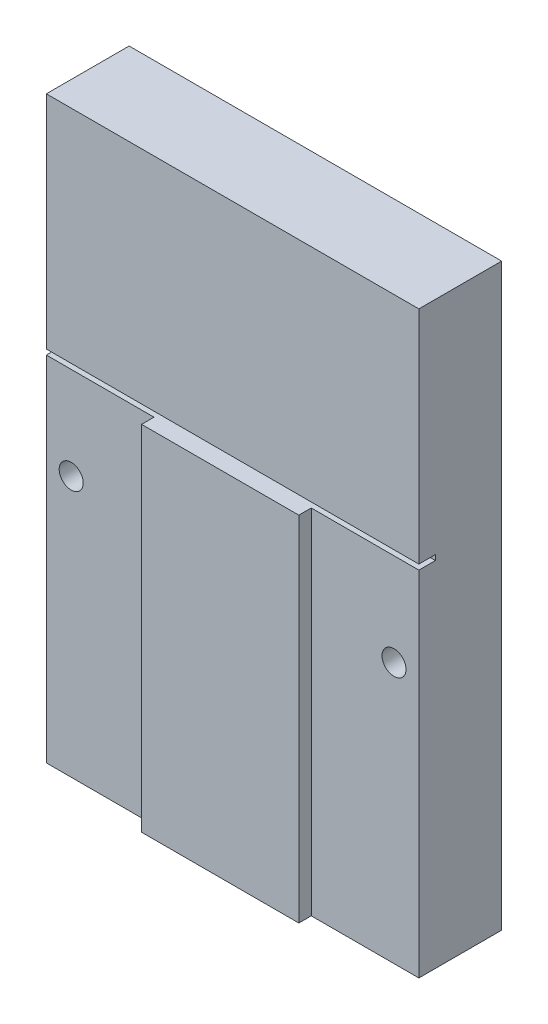
ISO-10303-21;
HEADER;
FILE_DESCRIPTION(('STEP AP214'),'2;1');
FILE_NAME('part.step','',(''),(''),'','','');
FILE_SCHEMA(('AUTOMOTIVE_DESIGN { 1 0 10303 214 1 1 1 1 }'));
ENDSEC;
DATA;
#1=APPLICATION_CONTEXT('core data for automotive mechanical design processes');
#2=APPLICATION_PROTOCOL_DEFINITION('international standard','automotive_design',2000,#1);
#3=PRODUCT_CONTEXT('',#1,'mechanical');
#4=PRODUCT('Part','Part','',(#3));
#5=PRODUCT_RELATED_PRODUCT_CATEGORY('part','',(#4));
#6=PRODUCT_DEFINITION_FORMATION('','',#4);
#7=PRODUCT_DEFINITION_CONTEXT('part definition',#1,'design');
#8=PRODUCT_DEFINITION('design','',#6,#7);
#9=PRODUCT_DEFINITION_SHAPE('','',#8);
#10=(LENGTH_UNIT() NAMED_UNIT(*) SI_UNIT(.MILLI.,.METRE.));
#11=(NAMED_UNIT(*) PLANE_ANGLE_UNIT() SI_UNIT($,.RADIAN.));
#12=(NAMED_UNIT(*) SI_UNIT($,.STERADIAN.) SOLID_ANGLE_UNIT());
#13=UNCERTAINTY_MEASURE_WITH_UNIT(LENGTH_MEASURE(1.E-05),#10,'distance_accuracy_value','');
#14=(GEOMETRIC_REPRESENTATION_CONTEXT(3) GLOBAL_UNCERTAINTY_ASSIGNED_CONTEXT((#13)) GLOBAL_UNIT_ASSIGNED_CONTEXT((#10,
#11,#12)) REPRESENTATION_CONTEXT('',''));
#15=CARTESIAN_POINT('',(0.,0.,0.));
#16=DIRECTION('',(0.,0.,1.));
#17=DIRECTION('',(1.,0.,0.));
#18=AXIS2_PLACEMENT_3D('',#15,#16,#17);
#19=CARTESIAN_POINT('',(22.5,40.,5.));
#20=DIRECTION('',(0.,0.,-1.));
#21=DIRECTION('',(-1.,0.,0.));
#22=AXIS2_PLACEMENT_3D('',#19,#20,#21);
#23=PLANE('',#22);
#24=CARTESIAN_POINT('',(-19.5,11.5,5.));
#25=DIRECTION('',(0.,0.,1.));
#26=DIRECTION('',(1.,0.,0.));
#27=AXIS2_PLACEMENT_3D('',#24,#25,#26);
#28=CIRCLE('',#27,1.45);
#29=CARTESIAN_POINT('',(-18.05,11.5,5.));
#30=VERTEX_POINT('',#29);
#31=EDGE_CURVE('E179',#30,#30,#28,.T.);
#32=ORIENTED_EDGE('',*,*,#31,.F.);
#33=EDGE_LOOP('',(#32));
#34=FACE_BOUND('',#33,.T.);
#35=DIRECTION('',(0.,-1.,0.));
#36=VECTOR('',#35,1.);
#37=CARTESIAN_POINT('',(-9.50000000000001,22.6713275749144,5.));
#38=LINE('',#37,#36);
#39=CARTESIAN_POINT('',(-9.50000000000001,22.6713275749144,5.));
#40=VERTEX_POINT('',#39);
#41=CARTESIAN_POINT('',(-9.5,-20.,5.));
#42=VERTEX_POINT('',#41);
#43=EDGE_CURVE('E155',#40,#42,#38,.T.);
#44=ORIENTED_EDGE('',*,*,#43,.F.);
#45=DIRECTION('',(1.,0.,0.));
#46=VECTOR('',#45,1.);
#47=CARTESIAN_POINT('',(-22.5,22.6713275749144,5.));
#48=LINE('',#47,#46);
#49=CARTESIAN_POINT('',(-22.5,22.6713275749144,5.));
#50=VERTEX_POINT('',#49);
#51=EDGE_CURVE('E159',#50,#40,#48,.T.);
#52=ORIENTED_EDGE('',*,*,#51,.F.);
#53=DIRECTION('',(0.,-1.,0.));
#54=VECTOR('',#53,1.);
#55=CARTESIAN_POINT('',(-22.5,40.,5.00000000000001));
#56=LINE('',#55,#54);
#57=CARTESIAN_POINT('',(-22.5,-20.,5.00000000000001));
#58=VERTEX_POINT('',#57);
#59=EDGE_CURVE('E50',#50,#58,#56,.T.);
#60=ORIENTED_EDGE('',*,*,#59,.T.);
#61=DIRECTION('',(-1.,0.,0.));
#62=VECTOR('',#61,1.);
#63=CARTESIAN_POINT('',(-22.5,-20.,5.00000000000001));
#64=LINE('',#63,#62);
#65=EDGE_CURVE('E200',#42,#58,#64,.T.);
#66=ORIENTED_EDGE('',*,*,#65,.F.);
#67=EDGE_LOOP('',(#44,#52,#60,#66));
#68=FACE_BOUND('',#67,.T.);
#69=ADVANCED_FACE('F41',(#34,#68),#23,.F.);
#70=CARTESIAN_POINT('',(19.5,11.5,5.));
#71=DIRECTION('',(0.,0.,1.));
#72=DIRECTION('',(1.,0.,0.));
#73=AXIS2_PLACEMENT_3D('',#70,#71,#72);
#74=CIRCLE('',#73,1.45);
#75=CARTESIAN_POINT('',(20.95,11.5,5.));
#76=VERTEX_POINT('',#75);
#77=EDGE_CURVE('E186',#76,#76,#74,.T.);
#78=ORIENTED_EDGE('',*,*,#77,.F.);
#79=EDGE_LOOP('',(#78));
#80=FACE_BOUND('',#79,.T.);
#81=DIRECTION('',(0.,1.,0.));
#82=VECTOR('',#81,1.);
#83=CARTESIAN_POINT('',(9.49999999999999,22.6713275749144,5.));
#84=LINE('',#83,#82);
#85=CARTESIAN_POINT('',(9.5,-20.,5.));
#86=VERTEX_POINT('',#85);
#87=CARTESIAN_POINT('',(9.49999999999998,22.6713275749144,5.));
#88=VERTEX_POINT('',#87);
#89=EDGE_CURVE('E151',#86,#88,#84,.T.);
#90=ORIENTED_EDGE('',*,*,#89,.F.);
#91=CARTESIAN_POINT('',(22.5,-20.,5.00000000000001));
#92=VERTEX_POINT('',#91);
#93=EDGE_CURVE('E201',#92,#86,#64,.T.);
#94=ORIENTED_EDGE('',*,*,#93,.F.);
#95=DIRECTION('',(0.,-1.,0.));
#96=VECTOR('',#95,1.);
#97=CARTESIAN_POINT('',(22.5,40.,5.));
#98=LINE('',#97,#96);
#99=CARTESIAN_POINT('',(22.5,22.6713275749144,5.));
#100=VERTEX_POINT('',#99);
#101=EDGE_CURVE('E219',#100,#92,#98,.T.);
#102=ORIENTED_EDGE('',*,*,#101,.F.);
#103=EDGE_CURVE('E157',#88,#100,#48,.T.);
#104=ORIENTED_EDGE('',*,*,#103,.F.);
#105=EDGE_LOOP('',(#90,#94,#102,#104));
#106=FACE_BOUND('',#105,.T.);
#107=ADVANCED_FACE('F248',(#80,#106),#23,.F.);
#108=CARTESIAN_POINT('',(-22.5,50.,5.));
#109=VERTEX_POINT('',#108);
#110=CARTESIAN_POINT('',(-22.5,23.2974929319475,5.));
#111=VERTEX_POINT('',#110);
#112=EDGE_CURVE('E11',#109,#111,#56,.T.);
#113=ORIENTED_EDGE('',*,*,#112,.T.);
#114=DIRECTION('',(-1.,0.,0.));
#115=VECTOR('',#114,1.);
#116=CARTESIAN_POINT('',(-22.5,23.2974929319475,5.));
#117=LINE('',#116,#115);
#118=CARTESIAN_POINT('',(22.5,23.2974929319475,5.));
#119=VERTEX_POINT('',#118);
#120=EDGE_CURVE('E166',#119,#111,#117,.T.);
#121=ORIENTED_EDGE('',*,*,#120,.F.);
#122=CARTESIAN_POINT('',(22.5,50.,5.));
#123=VERTEX_POINT('',#122);
#124=EDGE_CURVE('E220',#123,#119,#98,.T.);
#125=ORIENTED_EDGE('',*,*,#124,.F.);
#126=DIRECTION('',(1.,0.,0.));
#127=VECTOR('',#126,1.);
#128=CARTESIAN_POINT('',(-22.5,50.,5.));
#129=LINE('',#128,#127);
#130=EDGE_CURVE('E206',#109,#123,#129,.T.);
#131=ORIENTED_EDGE('',*,*,#130,.F.);
#132=EDGE_LOOP('',(#113,#121,#125,#131));
#133=FACE_BOUND('',#132,.T.);
#134=ADVANCED_FACE('F250',(#133),#23,.F.);
#135=CARTESIAN_POINT('',(-22.5,40.,-4.99999999999999));
#136=DIRECTION('',(1.,0.,0.));
#137=DIRECTION('',(0.,0.,-1.));
#138=AXIS2_PLACEMENT_3D('',#135,#136,#137);
#139=PLANE('',#138);
#140=DIRECTION('',(0.,-1.,0.));
#141=VECTOR('',#140,1.);
#142=CARTESIAN_POINT('',(-22.5,23.2974929319475,3.));
#143=LINE('',#142,#141);
#144=CARTESIAN_POINT('',(-22.5,23.2974929319475,3.));
#145=VERTEX_POINT('',#144);
#146=CARTESIAN_POINT('',(-22.5,22.6713275749144,3.));
#147=VERTEX_POINT('',#146);
#148=EDGE_CURVE('E164',#145,#147,#143,.T.);
#149=ORIENTED_EDGE('',*,*,#148,.F.);
#150=DIRECTION('',(0.,0.,1.));
#151=VECTOR('',#150,1.);
#152=CARTESIAN_POINT('',(-22.5,23.2974929319475,3.));
#153=LINE('',#152,#151);
#154=EDGE_CURVE('E176',#145,#111,#153,.T.);
#155=ORIENTED_EDGE('',*,*,#154,.T.);
#156=ORIENTED_EDGE('',*,*,#112,.F.);
#157=DIRECTION('',(0.,0.,1.));
#158=VECTOR('',#157,1.);
#159=CARTESIAN_POINT('',(-22.5,50.,-4.99999999999999));
#160=LINE('',#159,#158);
#161=CARTESIAN_POINT('',(-22.5,50.,-4.99999999999999));
#162=VERTEX_POINT('',#161);
#163=EDGE_CURVE('E203',#162,#109,#160,.T.);
#164=ORIENTED_EDGE('',*,*,#163,.F.);
#165=DIRECTION('',(0.,-1.,0.));
#166=VECTOR('',#165,1.);
#167=CARTESIAN_POINT('',(-22.5,40.,-4.99999999999999));
#168=LINE('',#167,#166);
#169=CARTESIAN_POINT('',(-22.5,-20.,-5.));
#170=VERTEX_POINT('',#169);
#171=EDGE_CURVE('E215',#162,#170,#168,.T.);
#172=ORIENTED_EDGE('',*,*,#171,.T.);
#173=DIRECTION('',(0.,0.,-1.));
#174=VECTOR('',#173,1.);
#175=CARTESIAN_POINT('',(-22.5,-20.,5.00000000000001));
#176=LINE('',#175,#174);
#177=EDGE_CURVE('E192',#58,#170,#176,.T.);
#178=ORIENTED_EDGE('',*,*,#177,.F.);
#179=ORIENTED_EDGE('',*,*,#59,.F.);
#180=DIRECTION('',(0.,0.,1.));
#181=VECTOR('',#180,1.);
#182=CARTESIAN_POINT('',(-22.5,22.6713275749144,3.));
#183=LINE('',#182,#181);
#184=EDGE_CURVE('E172',#147,#50,#183,.T.);
#185=ORIENTED_EDGE('',*,*,#184,.F.);
#186=EDGE_LOOP('',(#149,#155,#156,#164,#172,#178,#179,#185));
#187=FACE_BOUND('',#186,.T.);
#188=ADVANCED_FACE('F43',(#187),#139,.F.);
#189=CARTESIAN_POINT('',(22.5,40.,-5.));
#190=DIRECTION('',(-1.,0.,0.));
#191=DIRECTION('',(0.,0.,1.));
#192=AXIS2_PLACEMENT_3D('',#189,#190,#191);
#193=PLANE('',#192);
#194=ORIENTED_EDGE('',*,*,#124,.T.);
#195=DIRECTION('',(0.,0.,1.));
#196=VECTOR('',#195,1.);
#197=CARTESIAN_POINT('',(22.5,23.2974929319475,3.));
#198=LINE('',#197,#196);
#199=CARTESIAN_POINT('',(22.5,23.2974929319475,3.));
#200=VERTEX_POINT('',#199);
#201=EDGE_CURVE('E180',#200,#119,#198,.T.);
#202=ORIENTED_EDGE('',*,*,#201,.F.);
#203=DIRECTION('',(0.,1.,0.));
#204=VECTOR('',#203,1.);
#205=CARTESIAN_POINT('',(22.5,23.2974929319475,3.));
#206=LINE('',#205,#204);
#207=CARTESIAN_POINT('',(22.5,22.6713275749144,3.));
#208=VERTEX_POINT('',#207);
#209=EDGE_CURVE('E168',#208,#200,#206,.T.);
#210=ORIENTED_EDGE('',*,*,#209,.F.);
#211=DIRECTION('',(0.,0.,1.));
#212=VECTOR('',#211,1.);
#213=CARTESIAN_POINT('',(22.5,22.6713275749144,3.));
#214=LINE('',#213,#212);
#215=EDGE_CURVE('E182',#208,#100,#214,.T.);
#216=ORIENTED_EDGE('',*,*,#215,.T.);
#217=ORIENTED_EDGE('',*,*,#101,.T.);
#218=DIRECTION('',(0.,0.,1.));
#219=VECTOR('',#218,1.);
#220=CARTESIAN_POINT('',(22.5,-20.,5.00000000000001));
#221=LINE('',#220,#219);
#222=CARTESIAN_POINT('',(22.5,-20.,-5.));
#223=VERTEX_POINT('',#222);
#224=EDGE_CURVE('E197',#223,#92,#221,.T.);
#225=ORIENTED_EDGE('',*,*,#224,.F.);
#226=DIRECTION('',(0.,-1.,0.));
#227=VECTOR('',#226,1.);
#228=CARTESIAN_POINT('',(22.5,40.,-5.));
#229=LINE('',#228,#227);
#230=CARTESIAN_POINT('',(22.5,50.,-4.99999999999999));
#231=VERTEX_POINT('',#230);
#232=EDGE_CURVE('E217',#231,#223,#229,.T.);
#233=ORIENTED_EDGE('',*,*,#232,.F.);
#234=DIRECTION('',(0.,0.,-1.));
#235=VECTOR('',#234,1.);
#236=CARTESIAN_POINT('',(22.5,50.,-4.99999999999999));
#237=LINE('',#236,#235);
#238=EDGE_CURVE('E209',#123,#231,#237,.T.);
#239=ORIENTED_EDGE('',*,*,#238,.F.);
#240=EDGE_LOOP('',(#194,#202,#210,#216,#217,#225,#233,#239));
#241=FACE_BOUND('',#240,.T.);
#242=ADVANCED_FACE('F263',(#241),#193,.F.);
#243=CARTESIAN_POINT('',(22.5,40.,-5.));
#244=DIRECTION('',(0.,0.,1.));
#245=DIRECTION('',(1.,0.,0.));
#246=AXIS2_PLACEMENT_3D('',#243,#244,#245);
#247=PLANE('',#246);
#248=CARTESIAN_POINT('',(19.5,11.5,-5.));
#249=DIRECTION('',(0.,0.,1.));
#250=DIRECTION('',(1.,0.,0.));
#251=AXIS2_PLACEMENT_3D('',#248,#249,#250);
#252=CIRCLE('',#251,1.45);
#253=CARTESIAN_POINT('',(20.95,11.5,-5.));
#254=VERTEX_POINT('',#253);
#255=EDGE_CURVE('E45',#254,#254,#252,.T.);
#256=ORIENTED_EDGE('',*,*,#255,.T.);
#257=EDGE_LOOP('',(#256));
#258=FACE_BOUND('',#257,.T.);
#259=CARTESIAN_POINT('',(-19.5,11.5,-4.99999999999999));
#260=DIRECTION('',(0.,0.,1.));
#261=DIRECTION('',(1.,0.,0.));
#262=AXIS2_PLACEMENT_3D('',#259,#260,#261);
#263=CIRCLE('',#262,1.45);
#264=CARTESIAN_POINT('',(-18.05,11.5,-4.99999999999999));
#265=VERTEX_POINT('',#264);
#266=EDGE_CURVE('E189',#265,#265,#263,.T.);
#267=ORIENTED_EDGE('',*,*,#266,.T.);
#268=EDGE_LOOP('',(#267));
#269=FACE_BOUND('',#268,.T.);
#270=ORIENTED_EDGE('',*,*,#232,.T.);
#271=DIRECTION('',(1.,0.,0.));
#272=VECTOR('',#271,1.);
#273=CARTESIAN_POINT('',(-22.5,-20.,-5.));
#274=LINE('',#273,#272);
#275=EDGE_CURVE('E194',#170,#223,#274,.T.);
#276=ORIENTED_EDGE('',*,*,#275,.F.);
#277=ORIENTED_EDGE('',*,*,#171,.F.);
#278=DIRECTION('',(-1.,0.,0.));
#279=VECTOR('',#278,1.);
#280=CARTESIAN_POINT('',(-22.5,50.,-4.99999999999999));
#281=LINE('',#280,#279);
#282=EDGE_CURVE('E212',#231,#162,#281,.T.);
#283=ORIENTED_EDGE('',*,*,#282,.F.);
#284=EDGE_LOOP('',(#270,#276,#277,#283));
#285=FACE_BOUND('',#284,.T.);
#286=ADVANCED_FACE('F228',(#258,#269,#285),#247,.F.);
#287=CARTESIAN_POINT('',(0.,50.,0.));
#288=DIRECTION('',(0.,1.,0.));
#289=DIRECTION('',(0.,0.,1.));
#290=AXIS2_PLACEMENT_3D('',#287,#288,#289);
#291=PLANE('',#290);
#292=ORIENTED_EDGE('',*,*,#163,.T.);
#293=ORIENTED_EDGE('',*,*,#130,.T.);
#294=ORIENTED_EDGE('',*,*,#238,.T.);
#295=ORIENTED_EDGE('',*,*,#282,.T.);
#296=EDGE_LOOP('',(#292,#293,#294,#295));
#297=FACE_BOUND('',#296,.T.);
#298=ADVANCED_FACE('F278',(#297),#291,.T.);
#299=CARTESIAN_POINT('',(0.,-20.,0.));
#300=DIRECTION('',(0.,-1.,0.));
#301=DIRECTION('',(0.,0.,-1.));
#302=AXIS2_PLACEMENT_3D('',#299,#300,#301);
#303=PLANE('',#302);
#304=ORIENTED_EDGE('',*,*,#177,.T.);
#305=ORIENTED_EDGE('',*,*,#275,.T.);
#306=ORIENTED_EDGE('',*,*,#224,.T.);
#307=ORIENTED_EDGE('',*,*,#93,.T.);
#308=DIRECTION('',(0.,0.,-1.));
#309=VECTOR('',#308,1.);
#310=CARTESIAN_POINT('',(9.5,-20.,6.5));
#311=LINE('',#310,#309);
#312=CARTESIAN_POINT('',(9.5,-20.,6.5));
#313=VERTEX_POINT('',#312);
#314=EDGE_CURVE('E140',#313,#86,#311,.T.);
#315=ORIENTED_EDGE('',*,*,#314,.F.);
#316=DIRECTION('',(1.,0.,0.));
#317=VECTOR('',#316,1.);
#318=CARTESIAN_POINT('',(-9.5,-20.,6.5));
#319=LINE('',#318,#317);
#320=CARTESIAN_POINT('',(-9.5,-20.,6.5));
#321=VERTEX_POINT('',#320);
#322=EDGE_CURVE('E132',#321,#313,#319,.T.);
#323=ORIENTED_EDGE('',*,*,#322,.F.);
#324=DIRECTION('',(0.,0.,-1.));
#325=VECTOR('',#324,1.);
#326=CARTESIAN_POINT('',(-9.5,-20.,6.5));
#327=LINE('',#326,#325);
#328=EDGE_CURVE('E137',#321,#42,#327,.T.);
#329=ORIENTED_EDGE('',*,*,#328,.T.);
#330=ORIENTED_EDGE('',*,*,#65,.T.);
#331=EDGE_LOOP('',(#304,#305,#306,#307,#315,#323,#329,#330));
#332=FACE_BOUND('',#331,.T.);
#333=ADVANCED_FACE('F135',(#332),#303,.T.);
#334=CARTESIAN_POINT('',(-19.5,11.5,-15.));
#335=DIRECTION('',(0.,0.,1.));
#336=DIRECTION('',(1.,0.,0.));
#337=AXIS2_PLACEMENT_3D('',#334,#335,#336);
#338=CYLINDRICAL_SURFACE('',#337,1.45);
#339=ORIENTED_EDGE('',*,*,#31,.T.);
#340=EDGE_LOOP('',(#339));
#341=FACE_BOUND('',#340,.T.);
#342=ORIENTED_EDGE('',*,*,#266,.F.);
#343=EDGE_LOOP('',(#342));
#344=FACE_BOUND('',#343,.T.);
#345=ADVANCED_FACE('F233',(#341,#344),#338,.F.);
#346=CARTESIAN_POINT('',(19.5,11.5,-15.));
#347=DIRECTION('',(0.,0.,1.));
#348=DIRECTION('',(1.,0.,0.));
#349=AXIS2_PLACEMENT_3D('',#346,#347,#348);
#350=CYLINDRICAL_SURFACE('',#349,1.45);
#351=ORIENTED_EDGE('',*,*,#77,.T.);
#352=EDGE_LOOP('',(#351));
#353=FACE_BOUND('',#352,.T.);
#354=ORIENTED_EDGE('',*,*,#255,.F.);
#355=EDGE_LOOP('',(#354));
#356=FACE_BOUND('',#355,.T.);
#357=ADVANCED_FACE('F230',(#353,#356),#350,.F.);
#358=CARTESIAN_POINT('',(-22.5,23.2974929319475,3.));
#359=DIRECTION('',(0.,1.,0.));
#360=DIRECTION('',(0.,0.,1.));
#361=AXIS2_PLACEMENT_3D('',#358,#359,#360);
#362=PLANE('',#361);
#363=ORIENTED_EDGE('',*,*,#120,.T.);
#364=ORIENTED_EDGE('',*,*,#154,.F.);
#365=DIRECTION('',(-1.,0.,0.));
#366=VECTOR('',#365,1.);
#367=CARTESIAN_POINT('',(-22.5,23.2974929319475,3.));
#368=LINE('',#367,#366);
#369=EDGE_CURVE('E170',#200,#145,#368,.T.);
#370=ORIENTED_EDGE('',*,*,#369,.F.);
#371=ORIENTED_EDGE('',*,*,#201,.T.);
#372=EDGE_LOOP('',(#363,#364,#370,#371));
#373=FACE_BOUND('',#372,.T.);
#374=ADVANCED_FACE('F232',(#373),#362,.F.);
#375=CARTESIAN_POINT('',(-22.5,22.6713275749144,3.));
#376=DIRECTION('',(0.,-1.,0.));
#377=DIRECTION('',(0.,0.,-1.));
#378=AXIS2_PLACEMENT_3D('',#375,#376,#377);
#379=PLANE('',#378);
#380=ORIENTED_EDGE('',*,*,#51,.T.);
#381=DIRECTION('',(0.,0.,-1.));
#382=VECTOR('',#381,1.);
#383=CARTESIAN_POINT('',(-9.50000000000001,22.6713275749144,6.5));
#384=LINE('',#383,#382);
#385=CARTESIAN_POINT('',(-9.50000000000001,22.6713275749144,6.5));
#386=VERTEX_POINT('',#385);
#387=EDGE_CURVE('E287',#386,#40,#384,.T.);
#388=ORIENTED_EDGE('',*,*,#387,.F.);
#389=DIRECTION('',(-1.,0.,0.));
#390=VECTOR('',#389,1.);
#391=CARTESIAN_POINT('',(-9.50000000000001,22.6713275749144,6.5));
#392=LINE('',#391,#390);
#393=CARTESIAN_POINT('',(9.49999999999999,22.6713275749144,6.5));
#394=VERTEX_POINT('',#393);
#395=EDGE_CURVE('E148',#394,#386,#392,.T.);
#396=ORIENTED_EDGE('',*,*,#395,.F.);
#397=DIRECTION('',(0.,0.,-1.));
#398=VECTOR('',#397,1.);
#399=CARTESIAN_POINT('',(9.49999999999999,22.6713275749144,6.5));
#400=LINE('',#399,#398);
#401=EDGE_CURVE('E58',#394,#88,#400,.T.);
#402=ORIENTED_EDGE('',*,*,#401,.T.);
#403=ORIENTED_EDGE('',*,*,#103,.T.);
#404=ORIENTED_EDGE('',*,*,#215,.F.);
#405=DIRECTION('',(1.,0.,0.));
#406=VECTOR('',#405,1.);
#407=CARTESIAN_POINT('',(-22.5,22.6713275749144,3.));
#408=LINE('',#407,#406);
#409=EDGE_CURVE('E66',#147,#208,#408,.T.);
#410=ORIENTED_EDGE('',*,*,#409,.F.);
#411=ORIENTED_EDGE('',*,*,#184,.T.);
#412=EDGE_LOOP('',(#380,#388,#396,#402,#403,#404,#410,#411));
#413=FACE_BOUND('',#412,.T.);
#414=ADVANCED_FACE('F241',(#413),#379,.F.);
#415=CARTESIAN_POINT('',(0.,0.,3.));
#416=DIRECTION('',(0.,0.,1.));
#417=DIRECTION('',(1.,0.,0.));
#418=AXIS2_PLACEMENT_3D('',#415,#416,#417);
#419=PLANE('',#418);
#420=ORIENTED_EDGE('',*,*,#148,.T.);
#421=ORIENTED_EDGE('',*,*,#409,.T.);
#422=ORIENTED_EDGE('',*,*,#209,.T.);
#423=ORIENTED_EDGE('',*,*,#369,.T.);
#424=EDGE_LOOP('',(#420,#421,#422,#423));
#425=FACE_BOUND('',#424,.T.);
#426=ADVANCED_FACE('F272',(#425),#419,.T.);
#427=CARTESIAN_POINT('',(-9.50000000000001,22.6713275749144,6.5));
#428=DIRECTION('',(1.,0.,0.));
#429=DIRECTION('',(0.,1.,0.));
#430=AXIS2_PLACEMENT_3D('',#427,#428,#429);
#431=PLANE('',#430);
#432=ORIENTED_EDGE('',*,*,#43,.T.);
#433=ORIENTED_EDGE('',*,*,#328,.F.);
#434=DIRECTION('',(0.,-1.,0.));
#435=VECTOR('',#434,1.);
#436=CARTESIAN_POINT('',(-9.50000000000001,22.6713275749144,6.5));
#437=LINE('',#436,#435);
#438=EDGE_CURVE('E144',#386,#321,#437,.T.);
#439=ORIENTED_EDGE('',*,*,#438,.F.);
#440=ORIENTED_EDGE('',*,*,#387,.T.);
#441=EDGE_LOOP('',(#432,#433,#439,#440));
#442=FACE_BOUND('',#441,.T.);
#443=ADVANCED_FACE('F153',(#442),#431,.F.);
#444=CARTESIAN_POINT('',(9.49999999999999,22.6713275749144,6.5));
#445=DIRECTION('',(-1.,0.,0.));
#446=DIRECTION('',(0.,-1.,0.));
#447=AXIS2_PLACEMENT_3D('',#444,#445,#446);
#448=PLANE('',#447);
#449=ORIENTED_EDGE('',*,*,#89,.T.);
#450=ORIENTED_EDGE('',*,*,#401,.F.);
#451=DIRECTION('',(0.,1.,0.));
#452=VECTOR('',#451,1.);
#453=CARTESIAN_POINT('',(9.49999999999999,22.6713275749144,6.5));
#454=LINE('',#453,#452);
#455=EDGE_CURVE('E143',#313,#394,#454,.T.);
#456=ORIENTED_EDGE('',*,*,#455,.F.);
#457=ORIENTED_EDGE('',*,*,#314,.T.);
#458=EDGE_LOOP('',(#449,#450,#456,#457));
#459=FACE_BOUND('',#458,.T.);
#460=ADVANCED_FACE('F298',(#459),#448,.F.);
#461=CARTESIAN_POINT('',(0.,0.,6.5));
#462=DIRECTION('',(0.,0.,1.));
#463=DIRECTION('',(1.,0.,0.));
#464=AXIS2_PLACEMENT_3D('',#461,#462,#463);
#465=PLANE('',#464);
#466=ORIENTED_EDGE('',*,*,#438,.T.);
#467=ORIENTED_EDGE('',*,*,#322,.T.);
#468=ORIENTED_EDGE('',*,*,#455,.T.);
#469=ORIENTED_EDGE('',*,*,#395,.T.);
#470=EDGE_LOOP('',(#466,#467,#468,#469));
#471=FACE_BOUND('',#470,.T.);
#472=ADVANCED_FACE('F147',(#471),#465,.T.);
#473=CLOSED_SHELL('',(#69,#107,#134,#188,#242,#286,#298,#333,#345,#357,#374,#414,#426,#443,#460,#472));
#474=MANIFOLD_SOLID_BREP('B2',#473);
#475=ADVANCED_BREP_SHAPE_REPRESENTATION('',(#18,#474),#14);
#476=SHAPE_DEFINITION_REPRESENTATION(#9,#475);
ENDSEC;
END-ISO-10303-21;
